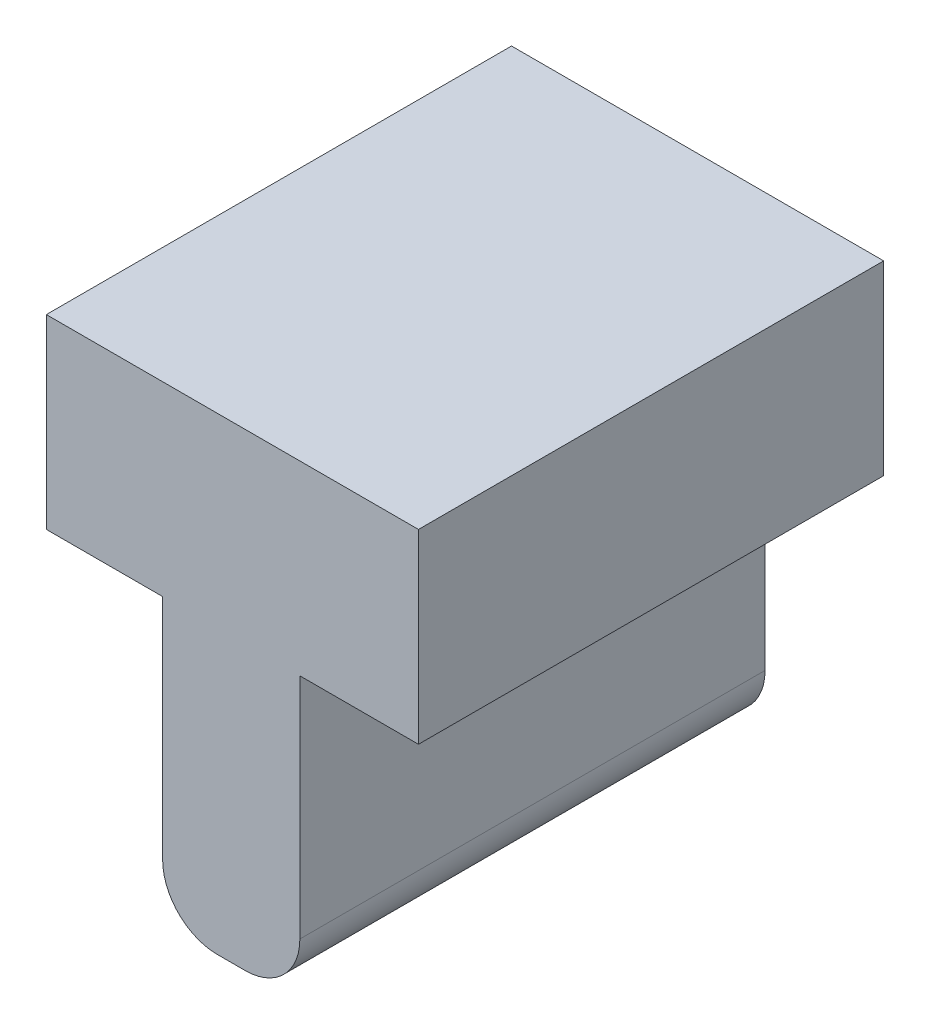
ISO-10303-21;
HEADER;
FILE_DESCRIPTION(('STEP AP214'),'2;1');
FILE_NAME('part.step','',(''),(''),'','','');
FILE_SCHEMA(('AUTOMOTIVE_DESIGN { 1 0 10303 214 1 1 1 1 }'));
ENDSEC;
DATA;
#1=APPLICATION_CONTEXT('core data for automotive mechanical design processes');
#2=APPLICATION_PROTOCOL_DEFINITION('international standard','automotive_design',2000,#1);
#3=PRODUCT_CONTEXT('',#1,'mechanical');
#4=PRODUCT('Part','Part','',(#3));
#5=PRODUCT_RELATED_PRODUCT_CATEGORY('part','',(#4));
#6=PRODUCT_DEFINITION_FORMATION('','',#4);
#7=PRODUCT_DEFINITION_CONTEXT('part definition',#1,'design');
#8=PRODUCT_DEFINITION('design','',#6,#7);
#9=PRODUCT_DEFINITION_SHAPE('','',#8);
#10=(LENGTH_UNIT() NAMED_UNIT(*) SI_UNIT(.MILLI.,.METRE.));
#11=(NAMED_UNIT(*) PLANE_ANGLE_UNIT() SI_UNIT($,.RADIAN.));
#12=(NAMED_UNIT(*) SI_UNIT($,.STERADIAN.) SOLID_ANGLE_UNIT());
#13=UNCERTAINTY_MEASURE_WITH_UNIT(LENGTH_MEASURE(1.E-05),#10,'distance_accuracy_value','');
#14=(GEOMETRIC_REPRESENTATION_CONTEXT(3) GLOBAL_UNCERTAINTY_ASSIGNED_CONTEXT((#13)) GLOBAL_UNIT_ASSIGNED_CONTEXT((#10,
#11,#12)) REPRESENTATION_CONTEXT('',''));
#15=CARTESIAN_POINT('',(0.,0.,0.));
#16=DIRECTION('',(0.,0.,1.));
#17=DIRECTION('',(1.,0.,0.));
#18=AXIS2_PLACEMENT_3D('',#15,#16,#17);
#19=CARTESIAN_POINT('',(-8.,16.075,-10.));
#20=DIRECTION('',(-1.,0.,0.));
#21=DIRECTION('',(0.,0.,1.));
#22=AXIS2_PLACEMENT_3D('',#19,#20,#21);
#23=PLANE('',#22);
#24=DIRECTION('',(0.,-1.,0.));
#25=VECTOR('',#24,1.);
#26=CARTESIAN_POINT('',(-8.,16.075,10.));
#27=LINE('',#26,#25);
#28=CARTESIAN_POINT('',(-8.,16.075,10.));
#29=VERTEX_POINT('',#28);
#30=CARTESIAN_POINT('',(-8.,8.075,10.));
#31=VERTEX_POINT('',#30);
#32=EDGE_CURVE('E154',#29,#31,#27,.T.);
#33=ORIENTED_EDGE('',*,*,#32,.F.);
#34=DIRECTION('',(0.,0.,1.));
#35=VECTOR('',#34,1.);
#36=CARTESIAN_POINT('',(-8.,16.075,-10.));
#37=LINE('',#36,#35);
#38=CARTESIAN_POINT('',(-8.,16.075,-10.));
#39=VERTEX_POINT('',#38);
#40=EDGE_CURVE('E11',#39,#29,#37,.T.);
#41=ORIENTED_EDGE('',*,*,#40,.F.);
#42=DIRECTION('',(0.,-1.,0.));
#43=VECTOR('',#42,1.);
#44=CARTESIAN_POINT('',(-8.,16.075,-10.));
#45=LINE('',#44,#43);
#46=CARTESIAN_POINT('',(-8.,8.075,-10.));
#47=VERTEX_POINT('',#46);
#48=EDGE_CURVE('E190',#39,#47,#45,.T.);
#49=ORIENTED_EDGE('',*,*,#48,.T.);
#50=DIRECTION('',(0.,0.,1.));
#51=VECTOR('',#50,1.);
#52=CARTESIAN_POINT('',(-8.,8.075,-10.));
#53=LINE('',#52,#51);
#54=EDGE_CURVE('E42',#47,#31,#53,.T.);
#55=ORIENTED_EDGE('',*,*,#54,.T.);
#56=EDGE_LOOP('',(#33,#41,#49,#55));
#57=FACE_BOUND('',#56,.T.);
#58=ADVANCED_FACE('F39',(#57),#23,.T.);
#59=CARTESIAN_POINT('',(8.,16.075,-10.));
#60=DIRECTION('',(0.,1.,0.));
#61=DIRECTION('',(-1.,0.,0.));
#62=AXIS2_PLACEMENT_3D('',#59,#60,#61);
#63=PLANE('',#62);
#64=DIRECTION('',(-1.,0.,0.));
#65=VECTOR('',#64,1.);
#66=CARTESIAN_POINT('',(8.,16.075,10.));
#67=LINE('',#66,#65);
#68=CARTESIAN_POINT('',(8.,16.075,10.));
#69=VERTEX_POINT('',#68);
#70=EDGE_CURVE('E187',#69,#29,#67,.T.);
#71=ORIENTED_EDGE('',*,*,#70,.F.);
#72=DIRECTION('',(0.,0.,1.));
#73=VECTOR('',#72,1.);
#74=CARTESIAN_POINT('',(8.,16.075,-10.));
#75=LINE('',#74,#73);
#76=CARTESIAN_POINT('',(8.,16.075,-10.));
#77=VERTEX_POINT('',#76);
#78=EDGE_CURVE('E49',#77,#69,#75,.T.);
#79=ORIENTED_EDGE('',*,*,#78,.F.);
#80=DIRECTION('',(-1.,0.,0.));
#81=VECTOR('',#80,1.);
#82=CARTESIAN_POINT('',(8.,16.075,-10.));
#83=LINE('',#82,#81);
#84=EDGE_CURVE('E140',#77,#39,#83,.T.);
#85=ORIENTED_EDGE('',*,*,#84,.T.);
#86=ORIENTED_EDGE('',*,*,#40,.T.);
#87=EDGE_LOOP('',(#71,#79,#85,#86));
#88=FACE_BOUND('',#87,.T.);
#89=ADVANCED_FACE('F214',(#88),#63,.T.);
#90=CARTESIAN_POINT('',(8.,8.075,-10.));
#91=DIRECTION('',(1.,0.,0.));
#92=DIRECTION('',(0.,0.,-1.));
#93=AXIS2_PLACEMENT_3D('',#90,#91,#92);
#94=PLANE('',#93);
#95=DIRECTION('',(0.,1.,0.));
#96=VECTOR('',#95,1.);
#97=CARTESIAN_POINT('',(8.,8.075,10.));
#98=LINE('',#97,#96);
#99=CARTESIAN_POINT('',(8.,8.075,10.));
#100=VERTEX_POINT('',#99);
#101=EDGE_CURVE('E126',#100,#69,#98,.T.);
#102=ORIENTED_EDGE('',*,*,#101,.F.);
#103=DIRECTION('',(0.,0.,1.));
#104=VECTOR('',#103,1.);
#105=CARTESIAN_POINT('',(8.,8.075,-10.));
#106=LINE('',#105,#104);
#107=CARTESIAN_POINT('',(8.,8.075,-10.));
#108=VERTEX_POINT('',#107);
#109=EDGE_CURVE('E121',#108,#100,#106,.T.);
#110=ORIENTED_EDGE('',*,*,#109,.F.);
#111=DIRECTION('',(0.,1.,0.));
#112=VECTOR('',#111,1.);
#113=CARTESIAN_POINT('',(8.,8.075,-10.));
#114=LINE('',#113,#112);
#115=EDGE_CURVE('E124',#108,#77,#114,.T.);
#116=ORIENTED_EDGE('',*,*,#115,.T.);
#117=ORIENTED_EDGE('',*,*,#78,.T.);
#118=EDGE_LOOP('',(#102,#110,#116,#117));
#119=FACE_BOUND('',#118,.T.);
#120=ADVANCED_FACE('F123',(#119),#94,.T.);
#121=CARTESIAN_POINT('',(8.,8.075,-10.));
#122=DIRECTION('',(0.,-1.,0.));
#123=DIRECTION('',(1.,0.,0.));
#124=AXIS2_PLACEMENT_3D('',#121,#122,#123);
#125=PLANE('',#124);
#126=DIRECTION('',(1.,0.,0.));
#127=VECTOR('',#126,1.);
#128=CARTESIAN_POINT('',(8.,8.075,10.));
#129=LINE('',#128,#127);
#130=CARTESIAN_POINT('',(2.9,8.075,10.));
#131=VERTEX_POINT('',#130);
#132=EDGE_CURVE('E182',#131,#100,#129,.T.);
#133=ORIENTED_EDGE('',*,*,#132,.F.);
#134=DIRECTION('',(0.,0.,1.));
#135=VECTOR('',#134,1.);
#136=CARTESIAN_POINT('',(2.9,8.075,-10.));
#137=LINE('',#136,#135);
#138=CARTESIAN_POINT('',(2.9,8.075,-10.));
#139=VERTEX_POINT('',#138);
#140=EDGE_CURVE('E132',#139,#131,#137,.T.);
#141=ORIENTED_EDGE('',*,*,#140,.F.);
#142=DIRECTION('',(1.,0.,0.));
#143=VECTOR('',#142,1.);
#144=CARTESIAN_POINT('',(8.,8.075,-10.));
#145=LINE('',#144,#143);
#146=EDGE_CURVE('E138',#139,#108,#145,.T.);
#147=ORIENTED_EDGE('',*,*,#146,.T.);
#148=ORIENTED_EDGE('',*,*,#109,.T.);
#149=EDGE_LOOP('',(#133,#141,#147,#148));
#150=FACE_BOUND('',#149,.T.);
#151=ADVANCED_FACE('F143',(#150),#125,.T.);
#152=CARTESIAN_POINT('',(2.9,-1.725,-10.));
#153=DIRECTION('',(1.,0.,0.));
#154=DIRECTION('',(0.,0.,-1.));
#155=AXIS2_PLACEMENT_3D('',#152,#153,#154);
#156=PLANE('',#155);
#157=DIRECTION('',(0.,1.,0.));
#158=VECTOR('',#157,1.);
#159=CARTESIAN_POINT('',(2.9,-1.725,10.));
#160=LINE('',#159,#158);
#161=CARTESIAN_POINT('',(2.9,-1.725,10.));
#162=VERTEX_POINT('',#161);
#163=EDGE_CURVE('E178',#162,#131,#160,.T.);
#164=ORIENTED_EDGE('',*,*,#163,.F.);
#165=DIRECTION('',(0.,0.,1.));
#166=VECTOR('',#165,1.);
#167=CARTESIAN_POINT('',(2.9,-1.725,-10.));
#168=LINE('',#167,#166);
#169=CARTESIAN_POINT('',(2.9,-1.725,-10.));
#170=VERTEX_POINT('',#169);
#171=EDGE_CURVE('E196',#170,#162,#168,.T.);
#172=ORIENTED_EDGE('',*,*,#171,.F.);
#173=DIRECTION('',(0.,1.,0.));
#174=VECTOR('',#173,1.);
#175=CARTESIAN_POINT('',(2.9,-1.725,-10.));
#176=LINE('',#175,#174);
#177=EDGE_CURVE('E145',#170,#139,#176,.T.);
#178=ORIENTED_EDGE('',*,*,#177,.T.);
#179=ORIENTED_EDGE('',*,*,#140,.T.);
#180=EDGE_LOOP('',(#164,#172,#178,#179));
#181=FACE_BOUND('',#180,.T.);
#182=ADVANCED_FACE('F227',(#181),#156,.T.);
#183=CARTESIAN_POINT('',(0.550000000000002,-1.725,-10.));
#184=DIRECTION('',(0.,0.,1.));
#185=DIRECTION('',(1.,0.,0.));
#186=AXIS2_PLACEMENT_3D('',#183,#184,#185);
#187=CYLINDRICAL_SURFACE('',#186,2.35);
#188=CARTESIAN_POINT('',(0.550000000000002,-1.725,10.));
#189=DIRECTION('',(0.,0.,1.));
#190=DIRECTION('',(1.,0.,0.));
#191=AXIS2_PLACEMENT_3D('',#188,#189,#190);
#192=CIRCLE('',#191,2.35);
#193=CARTESIAN_POINT('',(0.550000000000002,-4.075,10.));
#194=VERTEX_POINT('',#193);
#195=EDGE_CURVE('E174',#194,#162,#192,.T.);
#196=ORIENTED_EDGE('',*,*,#195,.F.);
#197=DIRECTION('',(0.,0.,1.));
#198=VECTOR('',#197,1.);
#199=CARTESIAN_POINT('',(0.550000000000002,-4.075,-10.));
#200=LINE('',#199,#198);
#201=CARTESIAN_POINT('',(0.550000000000002,-4.075,-10.));
#202=VERTEX_POINT('',#201);
#203=EDGE_CURVE('E199',#202,#194,#200,.T.);
#204=ORIENTED_EDGE('',*,*,#203,.F.);
#205=CARTESIAN_POINT('',(0.550000000000002,-1.725,-10.));
#206=DIRECTION('',(0.,0.,1.));
#207=DIRECTION('',(1.,0.,0.));
#208=AXIS2_PLACEMENT_3D('',#205,#206,#207);
#209=CIRCLE('',#208,2.35);
#210=EDGE_CURVE('E148',#202,#170,#209,.T.);
#211=ORIENTED_EDGE('',*,*,#210,.T.);
#212=ORIENTED_EDGE('',*,*,#171,.T.);
#213=EDGE_LOOP('',(#196,#204,#211,#212));
#214=FACE_BOUND('',#213,.T.);
#215=ADVANCED_FACE('F230',(#214),#187,.T.);
#216=CARTESIAN_POINT('',(-0.649999999999999,-4.075,-10.));
#217=DIRECTION('',(0.,-1.,0.));
#218=DIRECTION('',(1.,0.,0.));
#219=AXIS2_PLACEMENT_3D('',#216,#217,#218);
#220=PLANE('',#219);
#221=DIRECTION('',(1.,0.,0.));
#222=VECTOR('',#221,1.);
#223=CARTESIAN_POINT('',(-0.649999999999999,-4.075,10.));
#224=LINE('',#223,#222);
#225=CARTESIAN_POINT('',(-0.649999999999999,-4.075,10.));
#226=VERTEX_POINT('',#225);
#227=EDGE_CURVE('E170',#226,#194,#224,.T.);
#228=ORIENTED_EDGE('',*,*,#227,.F.);
#229=DIRECTION('',(0.,0.,1.));
#230=VECTOR('',#229,1.);
#231=CARTESIAN_POINT('',(-0.649999999999999,-4.075,-10.));
#232=LINE('',#231,#230);
#233=CARTESIAN_POINT('',(-0.649999999999999,-4.075,-10.));
#234=VERTEX_POINT('',#233);
#235=EDGE_CURVE('E202',#234,#226,#232,.T.);
#236=ORIENTED_EDGE('',*,*,#235,.F.);
#237=DIRECTION('',(1.,0.,0.));
#238=VECTOR('',#237,1.);
#239=CARTESIAN_POINT('',(-0.649999999999999,-4.075,-10.));
#240=LINE('',#239,#238);
#241=EDGE_CURVE('E329',#234,#202,#240,.T.);
#242=ORIENTED_EDGE('',*,*,#241,.T.);
#243=ORIENTED_EDGE('',*,*,#203,.T.);
#244=EDGE_LOOP('',(#228,#236,#242,#243));
#245=FACE_BOUND('',#244,.T.);
#246=ADVANCED_FACE('F234',(#245),#220,.T.);
#247=CARTESIAN_POINT('',(-0.649999999999999,-1.725,-10.));
#248=DIRECTION('',(0.,0.,1.));
#249=DIRECTION('',(1.,0.,0.));
#250=AXIS2_PLACEMENT_3D('',#247,#248,#249);
#251=CYLINDRICAL_SURFACE('',#250,2.35);
#252=CARTESIAN_POINT('',(-0.649999999999999,-1.725,10.));
#253=DIRECTION('',(0.,0.,1.));
#254=DIRECTION('',(1.,0.,0.));
#255=AXIS2_PLACEMENT_3D('',#252,#253,#254);
#256=CIRCLE('',#255,2.35);
#257=CARTESIAN_POINT('',(-3.,-1.725,10.));
#258=VERTEX_POINT('',#257);
#259=EDGE_CURVE('E166',#258,#226,#256,.T.);
#260=ORIENTED_EDGE('',*,*,#259,.F.);
#261=DIRECTION('',(0.,0.,1.));
#262=VECTOR('',#261,1.);
#263=CARTESIAN_POINT('',(-3.,-1.725,-10.));
#264=LINE('',#263,#262);
#265=CARTESIAN_POINT('',(-3.,-1.725,-10.));
#266=VERTEX_POINT('',#265);
#267=EDGE_CURVE('E205',#266,#258,#264,.T.);
#268=ORIENTED_EDGE('',*,*,#267,.F.);
#269=CARTESIAN_POINT('',(-0.649999999999999,-1.725,-10.));
#270=DIRECTION('',(0.,0.,1.));
#271=DIRECTION('',(1.,0.,0.));
#272=AXIS2_PLACEMENT_3D('',#269,#270,#271);
#273=CIRCLE('',#272,2.35);
#274=EDGE_CURVE('E325',#266,#234,#273,.T.);
#275=ORIENTED_EDGE('',*,*,#274,.T.);
#276=ORIENTED_EDGE('',*,*,#235,.T.);
#277=EDGE_LOOP('',(#260,#268,#275,#276));
#278=FACE_BOUND('',#277,.T.);
#279=ADVANCED_FACE('F238',(#278),#251,.T.);
#280=CARTESIAN_POINT('',(-3.,8.075,-10.));
#281=DIRECTION('',(-1.,0.,0.));
#282=DIRECTION('',(0.,-1.,0.));
#283=AXIS2_PLACEMENT_3D('',#280,#281,#282);
#284=PLANE('',#283);
#285=DIRECTION('',(0.,-1.,0.));
#286=VECTOR('',#285,1.);
#287=CARTESIAN_POINT('',(-3.,8.075,10.));
#288=LINE('',#287,#286);
#289=CARTESIAN_POINT('',(-3.,8.075,10.));
#290=VERTEX_POINT('',#289);
#291=EDGE_CURVE('E162',#290,#258,#288,.T.);
#292=ORIENTED_EDGE('',*,*,#291,.F.);
#293=DIRECTION('',(0.,0.,1.));
#294=VECTOR('',#293,1.);
#295=CARTESIAN_POINT('',(-3.,8.075,-10.));
#296=LINE('',#295,#294);
#297=CARTESIAN_POINT('',(-3.,8.075,-10.));
#298=VERTEX_POINT('',#297);
#299=EDGE_CURVE('E207',#298,#290,#296,.T.);
#300=ORIENTED_EDGE('',*,*,#299,.F.);
#301=DIRECTION('',(0.,-1.,0.));
#302=VECTOR('',#301,1.);
#303=CARTESIAN_POINT('',(-3.,8.075,-10.));
#304=LINE('',#303,#302);
#305=EDGE_CURVE('E339',#298,#266,#304,.T.);
#306=ORIENTED_EDGE('',*,*,#305,.T.);
#307=ORIENTED_EDGE('',*,*,#267,.T.);
#308=EDGE_LOOP('',(#292,#300,#306,#307));
#309=FACE_BOUND('',#308,.T.);
#310=ADVANCED_FACE('F242',(#309),#284,.T.);
#311=CARTESIAN_POINT('',(-3.,8.075,-10.));
#312=DIRECTION('',(0.,-1.,0.));
#313=DIRECTION('',(1.,0.,0.));
#314=AXIS2_PLACEMENT_3D('',#311,#312,#313);
#315=PLANE('',#314);
#316=DIRECTION('',(1.,0.,0.));
#317=VECTOR('',#316,1.);
#318=CARTESIAN_POINT('',(-3.,8.075,10.));
#319=LINE('',#318,#317);
#320=EDGE_CURVE('E158',#31,#290,#319,.T.);
#321=ORIENTED_EDGE('',*,*,#320,.F.);
#322=ORIENTED_EDGE('',*,*,#54,.F.);
#323=DIRECTION('',(1.,0.,0.));
#324=VECTOR('',#323,1.);
#325=CARTESIAN_POINT('',(-3.,8.075,-10.));
#326=LINE('',#325,#324);
#327=EDGE_CURVE('E342',#47,#298,#326,.T.);
#328=ORIENTED_EDGE('',*,*,#327,.T.);
#329=ORIENTED_EDGE('',*,*,#299,.T.);
#330=EDGE_LOOP('',(#321,#322,#328,#329));
#331=FACE_BOUND('',#330,.T.);
#332=ADVANCED_FACE('F211',(#331),#315,.T.);
#333=CARTESIAN_POINT('',(-0.649999999999999,-1.725,-10.));
#334=DIRECTION('',(0.,0.,1.));
#335=DIRECTION('',(1.,0.,0.));
#336=AXIS2_PLACEMENT_3D('',#333,#334,#335);
#337=PLANE('',#336);
#338=ORIENTED_EDGE('',*,*,#48,.F.);
#339=ORIENTED_EDGE('',*,*,#84,.F.);
#340=ORIENTED_EDGE('',*,*,#115,.F.);
#341=ORIENTED_EDGE('',*,*,#146,.F.);
#342=ORIENTED_EDGE('',*,*,#177,.F.);
#343=ORIENTED_EDGE('',*,*,#210,.F.);
#344=ORIENTED_EDGE('',*,*,#241,.F.);
#345=ORIENTED_EDGE('',*,*,#274,.F.);
#346=ORIENTED_EDGE('',*,*,#305,.F.);
#347=ORIENTED_EDGE('',*,*,#327,.F.);
#348=EDGE_LOOP('',(#338,#339,#340,#341,#342,#343,#344,#345,#346,#347));
#349=FACE_BOUND('',#348,.T.);
#350=ADVANCED_FACE('F136',(#349),#337,.F.);
#351=CARTESIAN_POINT('',(-0.649999999999999,-1.725,10.));
#352=DIRECTION('',(0.,0.,1.));
#353=DIRECTION('',(1.,0.,0.));
#354=AXIS2_PLACEMENT_3D('',#351,#352,#353);
#355=PLANE('',#354);
#356=ORIENTED_EDGE('',*,*,#32,.T.);
#357=ORIENTED_EDGE('',*,*,#320,.T.);
#358=ORIENTED_EDGE('',*,*,#291,.T.);
#359=ORIENTED_EDGE('',*,*,#259,.T.);
#360=ORIENTED_EDGE('',*,*,#227,.T.);
#361=ORIENTED_EDGE('',*,*,#195,.T.);
#362=ORIENTED_EDGE('',*,*,#163,.T.);
#363=ORIENTED_EDGE('',*,*,#132,.T.);
#364=ORIENTED_EDGE('',*,*,#101,.T.);
#365=ORIENTED_EDGE('',*,*,#70,.T.);
#366=EDGE_LOOP('',(#356,#357,#358,#359,#360,#361,#362,#363,#364,#365));
#367=FACE_BOUND('',#366,.T.);
#368=ADVANCED_FACE('F213',(#367),#355,.T.);
#369=CLOSED_SHELL('',(#58,#89,#120,#151,#182,#215,#246,#279,#310,#332,#350,#368));
#370=MANIFOLD_SOLID_BREP('B2',#369);
#371=ADVANCED_BREP_SHAPE_REPRESENTATION('',(#18,#370),#14);
#372=SHAPE_DEFINITION_REPRESENTATION(#9,#371);
ENDSEC;
END-ISO-10303-21;
